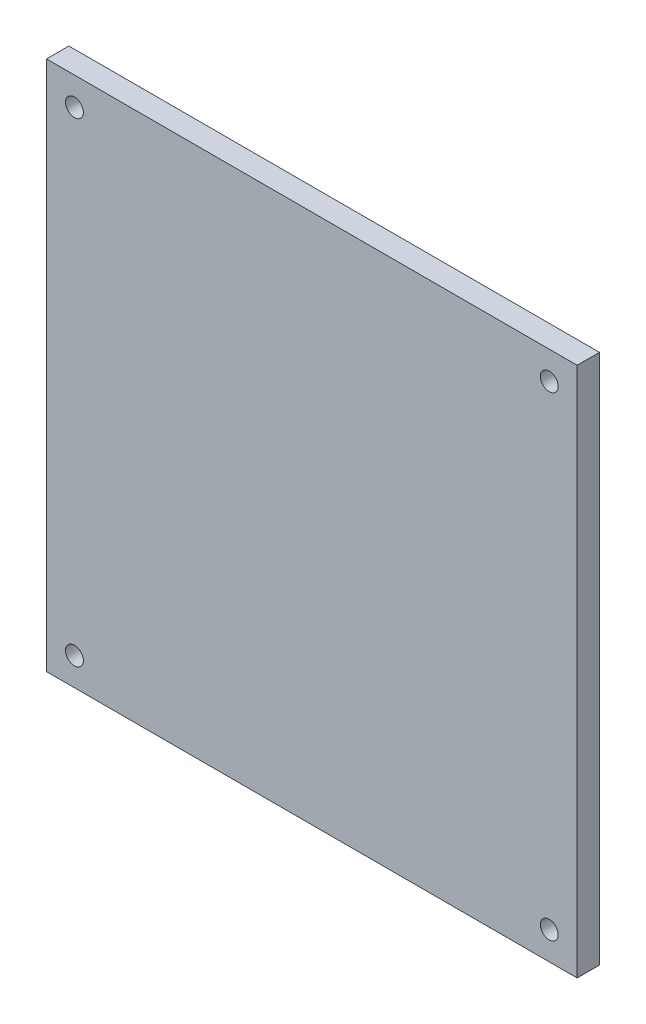
ISO-10303-21;
HEADER;
FILE_DESCRIPTION(('STEP AP214'),'2;1');
FILE_NAME('part.step','',(''),(''),'','','');
FILE_SCHEMA(('AUTOMOTIVE_DESIGN { 1 0 10303 214 1 1 1 1 }'));
ENDSEC;
DATA;
#1=APPLICATION_CONTEXT('core data for automotive mechanical design processes');
#2=APPLICATION_PROTOCOL_DEFINITION('international standard','automotive_design',2000,#1);
#3=PRODUCT_CONTEXT('',#1,'mechanical');
#4=PRODUCT('Part','Part','',(#3));
#5=PRODUCT_RELATED_PRODUCT_CATEGORY('part','',(#4));
#6=PRODUCT_DEFINITION_FORMATION('','',#4);
#7=PRODUCT_DEFINITION_CONTEXT('part definition',#1,'design');
#8=PRODUCT_DEFINITION('design','',#6,#7);
#9=PRODUCT_DEFINITION_SHAPE('','',#8);
#10=(LENGTH_UNIT() NAMED_UNIT(*) SI_UNIT(.MILLI.,.METRE.));
#11=(NAMED_UNIT(*) PLANE_ANGLE_UNIT() SI_UNIT($,.RADIAN.));
#12=(NAMED_UNIT(*) SI_UNIT($,.STERADIAN.) SOLID_ANGLE_UNIT());
#13=UNCERTAINTY_MEASURE_WITH_UNIT(LENGTH_MEASURE(1.E-05),#10,'distance_accuracy_value','');
#14=(GEOMETRIC_REPRESENTATION_CONTEXT(3) GLOBAL_UNCERTAINTY_ASSIGNED_CONTEXT((#13)) GLOBAL_UNIT_ASSIGNED_CONTEXT((#10,
#11,#12)) REPRESENTATION_CONTEXT('',''));
#15=CARTESIAN_POINT('',(0.,0.,0.));
#16=DIRECTION('',(0.,0.,1.));
#17=DIRECTION('',(1.,0.,0.));
#18=AXIS2_PLACEMENT_3D('',#15,#16,#17);
#19=CARTESIAN_POINT('',(47.5,47.5,2.));
#20=DIRECTION('',(-1.,0.,0.));
#21=DIRECTION('',(0.,-1.,0.));
#22=AXIS2_PLACEMENT_3D('',#19,#20,#21);
#23=PLANE('',#22);
#24=DIRECTION('',(0.,1.,0.));
#25=VECTOR('',#24,1.);
#26=CARTESIAN_POINT('',(47.5,47.5,0.));
#27=LINE('',#26,#25);
#28=CARTESIAN_POINT('',(47.5,0.,0.));
#29=VERTEX_POINT('',#28);
#30=CARTESIAN_POINT('',(47.5,47.5,0.));
#31=VERTEX_POINT('',#30);
#32=EDGE_CURVE('E105',#29,#31,#27,.T.);
#33=ORIENTED_EDGE('',*,*,#32,.T.);
#34=DIRECTION('',(0.,0.,-1.));
#35=VECTOR('',#34,1.);
#36=CARTESIAN_POINT('',(47.5,47.5,2.));
#37=LINE('',#36,#35);
#38=CARTESIAN_POINT('',(47.5,47.5,2.));
#39=VERTEX_POINT('',#38);
#40=EDGE_CURVE('E11',#39,#31,#37,.T.);
#41=ORIENTED_EDGE('',*,*,#40,.F.);
#42=DIRECTION('',(0.,1.,0.));
#43=VECTOR('',#42,1.);
#44=CARTESIAN_POINT('',(47.5,47.5,2.));
#45=LINE('',#44,#43);
#46=CARTESIAN_POINT('',(47.5,0.,2.));
#47=VERTEX_POINT('',#46);
#48=EDGE_CURVE('E89',#47,#39,#45,.T.);
#49=ORIENTED_EDGE('',*,*,#48,.F.);
#50=DIRECTION('',(0.,0.,-1.));
#51=VECTOR('',#50,1.);
#52=CARTESIAN_POINT('',(47.5,0.,2.));
#53=LINE('',#52,#51);
#54=EDGE_CURVE('E97',#47,#29,#53,.T.);
#55=ORIENTED_EDGE('',*,*,#54,.T.);
#56=EDGE_LOOP('',(#33,#41,#49,#55));
#57=FACE_BOUND('',#56,.T.);
#58=ADVANCED_FACE('F39',(#57),#23,.F.);
#59=CARTESIAN_POINT('',(47.5,47.5,2.));
#60=DIRECTION('',(0.,-1.,0.));
#61=DIRECTION('',(1.,0.,0.));
#62=AXIS2_PLACEMENT_3D('',#59,#60,#61);
#63=PLANE('',#62);
#64=DIRECTION('',(-1.,0.,0.));
#65=VECTOR('',#64,1.);
#66=CARTESIAN_POINT('',(47.5,47.5,0.));
#67=LINE('',#66,#65);
#68=CARTESIAN_POINT('',(0.,47.5,0.));
#69=VERTEX_POINT('',#68);
#70=EDGE_CURVE('E92',#31,#69,#67,.T.);
#71=ORIENTED_EDGE('',*,*,#70,.T.);
#72=DIRECTION('',(0.,0.,-1.));
#73=VECTOR('',#72,1.);
#74=CARTESIAN_POINT('',(0.,47.5,2.));
#75=LINE('',#74,#73);
#76=CARTESIAN_POINT('',(0.,47.5,2.));
#77=VERTEX_POINT('',#76);
#78=EDGE_CURVE('E50',#77,#69,#75,.T.);
#79=ORIENTED_EDGE('',*,*,#78,.F.);
#80=DIRECTION('',(-1.,0.,0.));
#81=VECTOR('',#80,1.);
#82=CARTESIAN_POINT('',(47.5,47.5,2.));
#83=LINE('',#82,#81);
#84=EDGE_CURVE('E82',#39,#77,#83,.T.);
#85=ORIENTED_EDGE('',*,*,#84,.F.);
#86=ORIENTED_EDGE('',*,*,#40,.T.);
#87=EDGE_LOOP('',(#71,#79,#85,#86));
#88=FACE_BOUND('',#87,.T.);
#89=ADVANCED_FACE('F93',(#88),#63,.F.);
#90=CARTESIAN_POINT('',(0.,47.5,2.));
#91=DIRECTION('',(1.,0.,0.));
#92=DIRECTION('',(0.,0.,-1.));
#93=AXIS2_PLACEMENT_3D('',#90,#91,#92);
#94=PLANE('',#93);
#95=DIRECTION('',(0.,-1.,0.));
#96=VECTOR('',#95,1.);
#97=CARTESIAN_POINT('',(0.,47.5,0.));
#98=LINE('',#97,#96);
#99=CARTESIAN_POINT('',(0.,0.,0.));
#100=VERTEX_POINT('',#99);
#101=EDGE_CURVE('E75',#69,#100,#98,.T.);
#102=ORIENTED_EDGE('',*,*,#101,.T.);
#103=DIRECTION('',(0.,0.,-1.));
#104=VECTOR('',#103,1.);
#105=CARTESIAN_POINT('',(0.,0.,2.));
#106=LINE('',#105,#104);
#107=CARTESIAN_POINT('',(0.,0.,2.));
#108=VERTEX_POINT('',#107);
#109=EDGE_CURVE('E94',#108,#100,#106,.T.);
#110=ORIENTED_EDGE('',*,*,#109,.F.);
#111=DIRECTION('',(0.,-1.,0.));
#112=VECTOR('',#111,1.);
#113=CARTESIAN_POINT('',(0.,47.5,2.));
#114=LINE('',#113,#112);
#115=EDGE_CURVE('E88',#77,#108,#114,.T.);
#116=ORIENTED_EDGE('',*,*,#115,.F.);
#117=ORIENTED_EDGE('',*,*,#78,.T.);
#118=EDGE_LOOP('',(#102,#110,#116,#117));
#119=FACE_BOUND('',#118,.T.);
#120=ADVANCED_FACE('F96',(#119),#94,.F.);
#121=CARTESIAN_POINT('',(47.5,0.,2.));
#122=DIRECTION('',(0.,1.,0.));
#123=DIRECTION('',(0.,0.,1.));
#124=AXIS2_PLACEMENT_3D('',#121,#122,#123);
#125=PLANE('',#124);
#126=DIRECTION('',(1.,0.,0.));
#127=VECTOR('',#126,1.);
#128=CARTESIAN_POINT('',(47.5,0.,0.));
#129=LINE('',#128,#127);
#130=EDGE_CURVE('E76',#100,#29,#129,.T.);
#131=ORIENTED_EDGE('',*,*,#130,.T.);
#132=ORIENTED_EDGE('',*,*,#54,.F.);
#133=DIRECTION('',(1.,0.,0.));
#134=VECTOR('',#133,1.);
#135=CARTESIAN_POINT('',(47.5,0.,2.));
#136=LINE('',#135,#134);
#137=EDGE_CURVE('E54',#108,#47,#136,.T.);
#138=ORIENTED_EDGE('',*,*,#137,.F.);
#139=ORIENTED_EDGE('',*,*,#109,.T.);
#140=EDGE_LOOP('',(#131,#132,#138,#139));
#141=FACE_BOUND('',#140,.T.);
#142=ADVANCED_FACE('F106',(#141),#125,.F.);
#143=CARTESIAN_POINT('',(0.,0.,2.));
#144=DIRECTION('',(0.,0.,-1.));
#145=DIRECTION('',(-1.,0.,0.));
#146=AXIS2_PLACEMENT_3D('',#143,#144,#145);
#147=PLANE('',#146);
#148=CARTESIAN_POINT('',(44.9999999999998,2.49999999999971,2.));
#149=DIRECTION('',(0.,0.,1.));
#150=DIRECTION('',(1.,0.,0.));
#151=AXIS2_PLACEMENT_3D('',#148,#149,#150);
#152=CIRCLE('',#151,0.799999999999998);
#153=CARTESIAN_POINT('',(45.7999999999998,2.49999999999971,2.));
#154=VERTEX_POINT('',#153);
#155=EDGE_CURVE('E124',#154,#154,#152,.T.);
#156=ORIENTED_EDGE('',*,*,#155,.F.);
#157=EDGE_LOOP('',(#156));
#158=FACE_BOUND('',#157,.T.);
#159=CARTESIAN_POINT('',(45.0000000000003,44.9999999999999,2.));
#160=DIRECTION('',(0.,0.,1.));
#161=DIRECTION('',(1.,0.,0.));
#162=AXIS2_PLACEMENT_3D('',#159,#160,#161);
#163=CIRCLE('',#162,0.800000000000001);
#164=CARTESIAN_POINT('',(45.8000000000003,44.9999999999999,2.));
#165=VERTEX_POINT('',#164);
#166=EDGE_CURVE('E131',#165,#165,#163,.T.);
#167=ORIENTED_EDGE('',*,*,#166,.F.);
#168=EDGE_LOOP('',(#167));
#169=FACE_BOUND('',#168,.T.);
#170=CARTESIAN_POINT('',(2.50000000000014,45.0000000000001,2.));
#171=DIRECTION('',(0.,0.,1.));
#172=DIRECTION('',(1.,0.,0.));
#173=AXIS2_PLACEMENT_3D('',#170,#171,#172);
#174=CIRCLE('',#173,0.800000000000002);
#175=CARTESIAN_POINT('',(3.30000000000014,45.0000000000001,2.));
#176=VERTEX_POINT('',#175);
#177=EDGE_CURVE('E119',#176,#176,#174,.T.);
#178=ORIENTED_EDGE('',*,*,#177,.F.);
#179=EDGE_LOOP('',(#178));
#180=FACE_BOUND('',#179,.T.);
#181=CARTESIAN_POINT('',(2.5,2.5,2.));
#182=DIRECTION('',(0.,0.,1.));
#183=DIRECTION('',(1.,0.,0.));
#184=AXIS2_PLACEMENT_3D('',#181,#182,#183);
#185=CIRCLE('',#184,0.799999999999998);
#186=CARTESIAN_POINT('',(3.3,2.5,2.));
#187=VERTEX_POINT('',#186);
#188=EDGE_CURVE('E117',#187,#187,#185,.T.);
#189=ORIENTED_EDGE('',*,*,#188,.F.);
#190=EDGE_LOOP('',(#189));
#191=FACE_BOUND('',#190,.T.);
#192=ORIENTED_EDGE('',*,*,#48,.T.);
#193=ORIENTED_EDGE('',*,*,#84,.T.);
#194=ORIENTED_EDGE('',*,*,#115,.T.);
#195=ORIENTED_EDGE('',*,*,#137,.T.);
#196=EDGE_LOOP('',(#192,#193,#194,#195));
#197=FACE_BOUND('',#196,.T.);
#198=ADVANCED_FACE('F86',(#158,#169,#180,#191,#197),#147,.F.);
#199=CARTESIAN_POINT('',(0.,0.,0.));
#200=DIRECTION('',(0.,0.,-1.));
#201=DIRECTION('',(-1.,0.,0.));
#202=AXIS2_PLACEMENT_3D('',#199,#200,#201);
#203=PLANE('',#202);
#204=CARTESIAN_POINT('',(44.9999999999998,2.49999999999971,0.));
#205=DIRECTION('',(0.,0.,1.));
#206=DIRECTION('',(1.,0.,0.));
#207=AXIS2_PLACEMENT_3D('',#204,#205,#206);
#208=CIRCLE('',#207,0.799999999999998);
#209=CARTESIAN_POINT('',(45.7999999999998,2.49999999999971,0.));
#210=VERTEX_POINT('',#209);
#211=EDGE_CURVE('E122',#210,#210,#208,.T.);
#212=ORIENTED_EDGE('',*,*,#211,.T.);
#213=EDGE_LOOP('',(#212));
#214=FACE_BOUND('',#213,.T.);
#215=CARTESIAN_POINT('',(45.0000000000003,44.9999999999999,0.));
#216=DIRECTION('',(0.,0.,1.));
#217=DIRECTION('',(1.,0.,0.));
#218=AXIS2_PLACEMENT_3D('',#215,#216,#217);
#219=CIRCLE('',#218,0.800000000000001);
#220=CARTESIAN_POINT('',(45.8000000000003,44.9999999999999,0.));
#221=VERTEX_POINT('',#220);
#222=EDGE_CURVE('E126',#221,#221,#219,.T.);
#223=ORIENTED_EDGE('',*,*,#222,.T.);
#224=EDGE_LOOP('',(#223));
#225=FACE_BOUND('',#224,.T.);
#226=CARTESIAN_POINT('',(2.50000000000014,45.0000000000001,0.));
#227=DIRECTION('',(0.,0.,1.));
#228=DIRECTION('',(1.,0.,0.));
#229=AXIS2_PLACEMENT_3D('',#226,#227,#228);
#230=CIRCLE('',#229,0.800000000000002);
#231=CARTESIAN_POINT('',(3.30000000000014,45.0000000000001,0.));
#232=VERTEX_POINT('',#231);
#233=EDGE_CURVE('E132',#232,#232,#230,.T.);
#234=ORIENTED_EDGE('',*,*,#233,.T.);
#235=EDGE_LOOP('',(#234));
#236=FACE_BOUND('',#235,.T.);
#237=CARTESIAN_POINT('',(2.5,2.5,0.));
#238=DIRECTION('',(0.,0.,1.));
#239=DIRECTION('',(1.,0.,0.));
#240=AXIS2_PLACEMENT_3D('',#237,#238,#239);
#241=CIRCLE('',#240,0.799999999999998);
#242=CARTESIAN_POINT('',(3.3,2.5,0.));
#243=VERTEX_POINT('',#242);
#244=EDGE_CURVE('E103',#243,#243,#241,.T.);
#245=ORIENTED_EDGE('',*,*,#244,.T.);
#246=EDGE_LOOP('',(#245));
#247=FACE_BOUND('',#246,.T.);
#248=ORIENTED_EDGE('',*,*,#32,.F.);
#249=ORIENTED_EDGE('',*,*,#130,.F.);
#250=ORIENTED_EDGE('',*,*,#101,.F.);
#251=ORIENTED_EDGE('',*,*,#70,.F.);
#252=EDGE_LOOP('',(#248,#249,#250,#251));
#253=FACE_BOUND('',#252,.T.);
#254=ADVANCED_FACE('F111',(#214,#225,#236,#247,#253),#203,.T.);
#255=CARTESIAN_POINT('',(2.5,2.5,0.));
#256=DIRECTION('',(0.,0.,1.));
#257=DIRECTION('',(1.,0.,0.));
#258=AXIS2_PLACEMENT_3D('',#255,#256,#257);
#259=CYLINDRICAL_SURFACE('',#258,0.799999999999998);
#260=ORIENTED_EDGE('',*,*,#244,.F.);
#261=EDGE_LOOP('',(#260));
#262=FACE_BOUND('',#261,.T.);
#263=ORIENTED_EDGE('',*,*,#188,.T.);
#264=EDGE_LOOP('',(#263));
#265=FACE_BOUND('',#264,.T.);
#266=ADVANCED_FACE('F149',(#262,#265),#259,.F.);
#267=CARTESIAN_POINT('',(2.50000000000014,45.0000000000001,0.));
#268=DIRECTION('',(0.,0.,1.));
#269=DIRECTION('',(1.,0.,0.));
#270=AXIS2_PLACEMENT_3D('',#267,#268,#269);
#271=CYLINDRICAL_SURFACE('',#270,0.800000000000002);
#272=ORIENTED_EDGE('',*,*,#233,.F.);
#273=EDGE_LOOP('',(#272));
#274=FACE_BOUND('',#273,.T.);
#275=ORIENTED_EDGE('',*,*,#177,.T.);
#276=EDGE_LOOP('',(#275));
#277=FACE_BOUND('',#276,.T.);
#278=ADVANCED_FACE('F139',(#274,#277),#271,.F.);
#279=CARTESIAN_POINT('',(45.0000000000003,44.9999999999999,0.));
#280=DIRECTION('',(0.,0.,1.));
#281=DIRECTION('',(1.,0.,0.));
#282=AXIS2_PLACEMENT_3D('',#279,#280,#281);
#283=CYLINDRICAL_SURFACE('',#282,0.800000000000001);
#284=ORIENTED_EDGE('',*,*,#222,.F.);
#285=EDGE_LOOP('',(#284));
#286=FACE_BOUND('',#285,.T.);
#287=ORIENTED_EDGE('',*,*,#166,.T.);
#288=EDGE_LOOP('',(#287));
#289=FACE_BOUND('',#288,.T.);
#290=ADVANCED_FACE('F157',(#286,#289),#283,.F.);
#291=CARTESIAN_POINT('',(44.9999999999998,2.49999999999971,0.));
#292=DIRECTION('',(0.,0.,1.));
#293=DIRECTION('',(1.,0.,0.));
#294=AXIS2_PLACEMENT_3D('',#291,#292,#293);
#295=CYLINDRICAL_SURFACE('',#294,0.799999999999998);
#296=ORIENTED_EDGE('',*,*,#211,.F.);
#297=EDGE_LOOP('',(#296));
#298=FACE_BOUND('',#297,.T.);
#299=ORIENTED_EDGE('',*,*,#155,.T.);
#300=EDGE_LOOP('',(#299));
#301=FACE_BOUND('',#300,.T.);
#302=ADVANCED_FACE('F210',(#298,#301),#295,.F.);
#303=CLOSED_SHELL('',(#58,#89,#120,#142,#198,#254,#266,#278,#290,#302));
#304=MANIFOLD_SOLID_BREP('B2',#303);
#305=ADVANCED_BREP_SHAPE_REPRESENTATION('',(#18,#304),#14);
#306=SHAPE_DEFINITION_REPRESENTATION(#9,#305);
ENDSEC;
END-ISO-10303-21;
